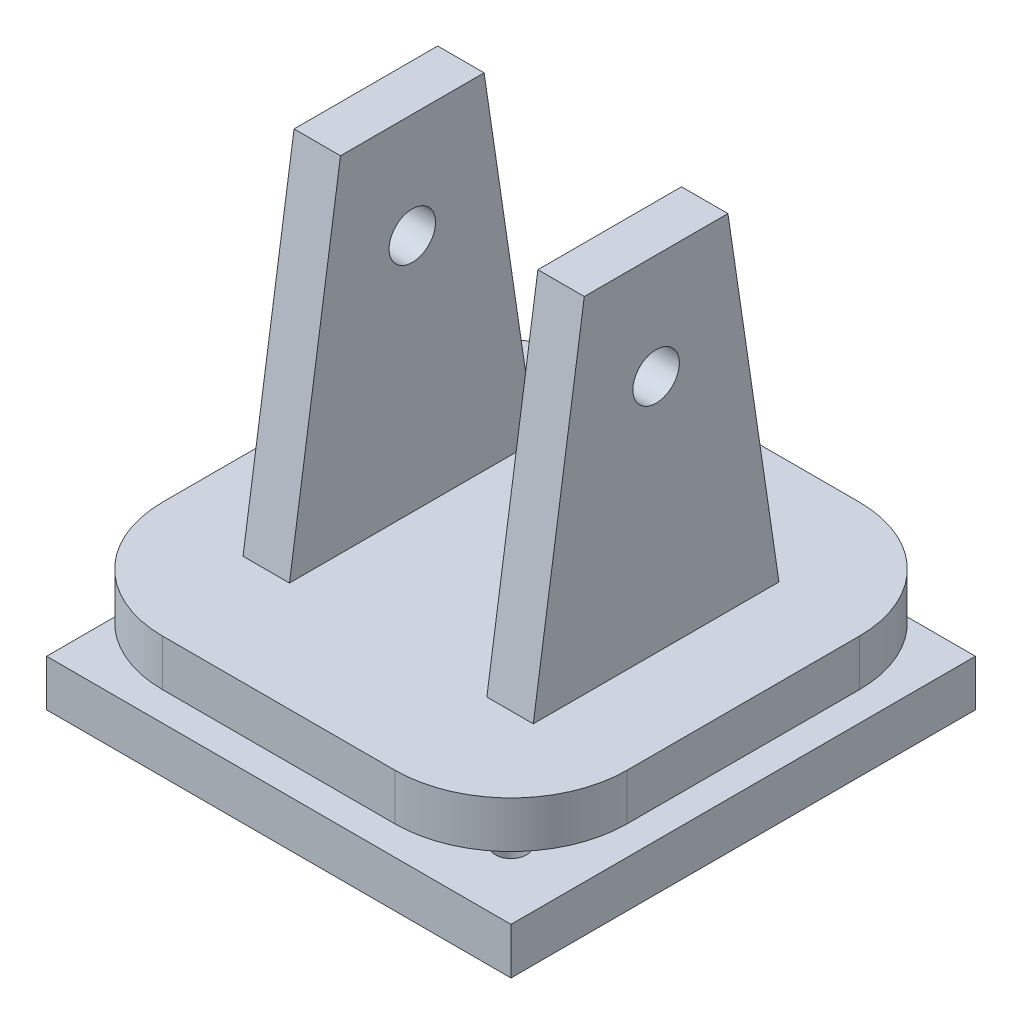
ISO-10303-21;
HEADER;
FILE_DESCRIPTION(('STEP AP214'),'2;1');
FILE_NAME('part.step','',(''),(''),'','','');
FILE_SCHEMA(('AUTOMOTIVE_DESIGN { 1 0 10303 214 1 1 1 1 }'));
ENDSEC;
DATA;
#1=APPLICATION_CONTEXT('core data for automotive mechanical design processes');
#2=APPLICATION_PROTOCOL_DEFINITION('international standard','automotive_design',2000,#1);
#3=PRODUCT_CONTEXT('',#1,'mechanical');
#4=PRODUCT('Part','Part','',(#3));
#5=PRODUCT_RELATED_PRODUCT_CATEGORY('part','',(#4));
#6=PRODUCT_DEFINITION_FORMATION('','',#4);
#7=PRODUCT_DEFINITION_CONTEXT('part definition',#1,'design');
#8=PRODUCT_DEFINITION('design','',#6,#7);
#9=PRODUCT_DEFINITION_SHAPE('','',#8);
#10=(LENGTH_UNIT() NAMED_UNIT(*) SI_UNIT(.MILLI.,.METRE.));
#11=(NAMED_UNIT(*) PLANE_ANGLE_UNIT() SI_UNIT($,.RADIAN.));
#12=(NAMED_UNIT(*) SI_UNIT($,.STERADIAN.) SOLID_ANGLE_UNIT());
#13=UNCERTAINTY_MEASURE_WITH_UNIT(LENGTH_MEASURE(1.E-05),#10,'distance_accuracy_value','');
#14=(GEOMETRIC_REPRESENTATION_CONTEXT(3) GLOBAL_UNCERTAINTY_ASSIGNED_CONTEXT((#13)) GLOBAL_UNIT_ASSIGNED_CONTEXT((#10,
#11,#12)) REPRESENTATION_CONTEXT('',''));
#15=CARTESIAN_POINT('',(0.,0.,0.));
#16=DIRECTION('',(0.,0.,1.));
#17=DIRECTION('',(1.,0.,0.));
#18=AXIS2_PLACEMENT_3D('',#15,#16,#17);
#19=CARTESIAN_POINT('',(40.,8.,-40.));
#20=DIRECTION('',(-1.,0.,0.));
#21=DIRECTION('',(0.,0.,1.));
#22=AXIS2_PLACEMENT_3D('',#19,#20,#21);
#23=PLANE('',#22);
#24=DIRECTION('',(0.,0.,-1.));
#25=VECTOR('',#24,1.);
#26=CARTESIAN_POINT('',(40.,0.,-40.));
#27=LINE('',#26,#25);
#28=CARTESIAN_POINT('',(40.,0.,20.));
#29=VERTEX_POINT('',#28);
#30=CARTESIAN_POINT('',(40.,0.,-20.));
#31=VERTEX_POINT('',#30);
#32=EDGE_CURVE('E334',#29,#31,#27,.T.);
#33=ORIENTED_EDGE('',*,*,#32,.T.);
#34=DIRECTION('',(0.,-1.,0.));
#35=VECTOR('',#34,1.);
#36=CARTESIAN_POINT('',(40.,8.,-20.));
#37=LINE('',#36,#35);
#38=CARTESIAN_POINT('',(40.,8.,-20.));
#39=VERTEX_POINT('',#38);
#40=EDGE_CURVE('E391',#31,#39,#37,.F.);
#41=ORIENTED_EDGE('',*,*,#40,.T.);
#42=DIRECTION('',(0.,0.,-1.));
#43=VECTOR('',#42,1.);
#44=CARTESIAN_POINT('',(40.,8.,-40.));
#45=LINE('',#44,#43);
#46=CARTESIAN_POINT('',(40.,8.,20.));
#47=VERTEX_POINT('',#46);
#48=EDGE_CURVE('E335',#47,#39,#45,.T.);
#49=ORIENTED_EDGE('',*,*,#48,.F.);
#50=DIRECTION('',(0.,-1.,0.));
#51=VECTOR('',#50,1.);
#52=CARTESIAN_POINT('',(40.,8.,20.));
#53=LINE('',#52,#51);
#54=EDGE_CURVE('E387',#47,#29,#53,.T.);
#55=ORIENTED_EDGE('',*,*,#54,.T.);
#56=EDGE_LOOP('',(#33,#41,#49,#55));
#57=FACE_BOUND('',#56,.T.);
#58=ADVANCED_FACE('F47',(#57),#23,.F.);
#59=CARTESIAN_POINT('',(-40.,8.,-40.));
#60=DIRECTION('',(0.,0.,1.));
#61=DIRECTION('',(1.,0.,0.));
#62=AXIS2_PLACEMENT_3D('',#59,#60,#61);
#63=PLANE('',#62);
#64=DIRECTION('',(-1.,0.,0.));
#65=VECTOR('',#64,1.);
#66=CARTESIAN_POINT('',(-40.,8.,-40.));
#67=LINE('',#66,#65);
#68=CARTESIAN_POINT('',(20.,8.,-40.));
#69=VERTEX_POINT('',#68);
#70=CARTESIAN_POINT('',(-20.,8.,-40.));
#71=VERTEX_POINT('',#70);
#72=EDGE_CURVE('E339',#69,#71,#67,.T.);
#73=ORIENTED_EDGE('',*,*,#72,.F.);
#74=DIRECTION('',(0.,-1.,0.));
#75=VECTOR('',#74,1.);
#76=CARTESIAN_POINT('',(20.,8.,-40.));
#77=LINE('',#76,#75);
#78=CARTESIAN_POINT('',(20.,0.,-40.));
#79=VERTEX_POINT('',#78);
#80=EDGE_CURVE('E374',#69,#79,#77,.T.);
#81=ORIENTED_EDGE('',*,*,#80,.T.);
#82=DIRECTION('',(-1.,0.,0.));
#83=VECTOR('',#82,1.);
#84=CARTESIAN_POINT('',(-40.,0.,-40.));
#85=LINE('',#84,#83);
#86=CARTESIAN_POINT('',(-20.,0.,-40.));
#87=VERTEX_POINT('',#86);
#88=EDGE_CURVE('E351',#79,#87,#85,.T.);
#89=ORIENTED_EDGE('',*,*,#88,.T.);
#90=DIRECTION('',(0.,-1.,0.));
#91=VECTOR('',#90,1.);
#92=CARTESIAN_POINT('',(-20.,8.,-40.));
#93=LINE('',#92,#91);
#94=EDGE_CURVE('E367',#87,#71,#93,.F.);
#95=ORIENTED_EDGE('',*,*,#94,.T.);
#96=EDGE_LOOP('',(#73,#81,#89,#95));
#97=FACE_BOUND('',#96,.T.);
#98=ADVANCED_FACE('F550',(#97),#63,.F.);
#99=CARTESIAN_POINT('',(-40.,8.,-40.));
#100=DIRECTION('',(1.,0.,0.));
#101=DIRECTION('',(0.,0.,-1.));
#102=AXIS2_PLACEMENT_3D('',#99,#100,#101);
#103=PLANE('',#102);
#104=DIRECTION('',(0.,0.,1.));
#105=VECTOR('',#104,1.);
#106=CARTESIAN_POINT('',(-40.,0.,-40.));
#107=LINE('',#106,#105);
#108=CARTESIAN_POINT('',(-40.,0.,-20.));
#109=VERTEX_POINT('',#108);
#110=CARTESIAN_POINT('',(-40.,0.,20.));
#111=VERTEX_POINT('',#110);
#112=EDGE_CURVE('E354',#109,#111,#107,.T.);
#113=ORIENTED_EDGE('',*,*,#112,.T.);
#114=DIRECTION('',(0.,-1.,0.));
#115=VECTOR('',#114,1.);
#116=CARTESIAN_POINT('',(-40.,8.,20.));
#117=LINE('',#116,#115);
#118=CARTESIAN_POINT('',(-40.,8.,20.));
#119=VERTEX_POINT('',#118);
#120=EDGE_CURVE('E11',#111,#119,#117,.F.);
#121=ORIENTED_EDGE('',*,*,#120,.T.);
#122=DIRECTION('',(0.,0.,1.));
#123=VECTOR('',#122,1.);
#124=CARTESIAN_POINT('',(-40.,8.,-40.));
#125=LINE('',#124,#123);
#126=CARTESIAN_POINT('',(-40.,8.,-20.));
#127=VERTEX_POINT('',#126);
#128=EDGE_CURVE('E343',#127,#119,#125,.T.);
#129=ORIENTED_EDGE('',*,*,#128,.F.);
#130=DIRECTION('',(0.,-1.,0.));
#131=VECTOR('',#130,1.);
#132=CARTESIAN_POINT('',(-40.,8.,-20.));
#133=LINE('',#132,#131);
#134=EDGE_CURVE('E232',#127,#109,#133,.T.);
#135=ORIENTED_EDGE('',*,*,#134,.T.);
#136=EDGE_LOOP('',(#113,#121,#129,#135));
#137=FACE_BOUND('',#136,.T.);
#138=ADVANCED_FACE('F555',(#137),#103,.F.);
#139=CARTESIAN_POINT('',(-40.,8.,40.));
#140=DIRECTION('',(0.,0.,-1.));
#141=DIRECTION('',(-1.,0.,0.));
#142=AXIS2_PLACEMENT_3D('',#139,#140,#141);
#143=PLANE('',#142);
#144=DIRECTION('',(1.,0.,0.));
#145=VECTOR('',#144,1.);
#146=CARTESIAN_POINT('',(-40.,0.,40.));
#147=LINE('',#146,#145);
#148=CARTESIAN_POINT('',(-20.,0.,40.));
#149=VERTEX_POINT('',#148);
#150=CARTESIAN_POINT('',(20.,0.,40.));
#151=VERTEX_POINT('',#150);
#152=EDGE_CURVE('E340',#149,#151,#147,.T.);
#153=ORIENTED_EDGE('',*,*,#152,.T.);
#154=DIRECTION('',(0.,-1.,0.));
#155=VECTOR('',#154,1.);
#156=CARTESIAN_POINT('',(20.,8.,40.));
#157=LINE('',#156,#155);
#158=CARTESIAN_POINT('',(20.,8.,40.));
#159=VERTEX_POINT('',#158);
#160=EDGE_CURVE('E56',#151,#159,#157,.F.);
#161=ORIENTED_EDGE('',*,*,#160,.T.);
#162=DIRECTION('',(1.,0.,0.));
#163=VECTOR('',#162,1.);
#164=CARTESIAN_POINT('',(-40.,8.,40.));
#165=LINE('',#164,#163);
#166=CARTESIAN_POINT('',(-20.,8.,40.));
#167=VERTEX_POINT('',#166);
#168=EDGE_CURVE('E233',#167,#159,#165,.T.);
#169=ORIENTED_EDGE('',*,*,#168,.F.);
#170=DIRECTION('',(0.,-1.,0.));
#171=VECTOR('',#170,1.);
#172=CARTESIAN_POINT('',(-20.,8.,40.));
#173=LINE('',#172,#171);
#174=EDGE_CURVE('E401',#167,#149,#173,.T.);
#175=ORIENTED_EDGE('',*,*,#174,.T.);
#176=EDGE_LOOP('',(#153,#161,#169,#175));
#177=FACE_BOUND('',#176,.T.);
#178=ADVANCED_FACE('F592',(#177),#143,.F.);
#179=CARTESIAN_POINT('',(0.,8.,0.));
#180=DIRECTION('',(0.,1.,0.));
#181=DIRECTION('',(0.,0.,1.));
#182=AXIS2_PLACEMENT_3D('',#179,#180,#181);
#183=PLANE('',#182);
#184=DIRECTION('',(0.,0.,-1.));
#185=VECTOR('',#184,1.);
#186=CARTESIAN_POINT('',(17.,8.,21.1610918877355));
#187=LINE('',#186,#185);
#188=CARTESIAN_POINT('',(17.,8.,21.1610918877355));
#189=VERTEX_POINT('',#188);
#190=CARTESIAN_POINT('',(17.,8.00000000000001,-21.1610918877355));
#191=VERTEX_POINT('',#190);
#192=EDGE_CURVE('E250',#189,#191,#187,.T.);
#193=ORIENTED_EDGE('',*,*,#192,.T.);
#194=DIRECTION('',(1.,0.,0.));
#195=VECTOR('',#194,1.);
#196=CARTESIAN_POINT('',(17.,8.00000000000001,-21.1610918877355));
#197=LINE('',#196,#195);
#198=CARTESIAN_POINT('',(25.,8.00000000000001,-21.1610918877355));
#199=VERTEX_POINT('',#198);
#200=EDGE_CURVE('E267',#191,#199,#197,.T.);
#201=ORIENTED_EDGE('',*,*,#200,.T.);
#202=DIRECTION('',(0.,0.,-1.));
#203=VECTOR('',#202,1.);
#204=CARTESIAN_POINT('',(25.,8.,21.1610918877355));
#205=LINE('',#204,#203);
#206=CARTESIAN_POINT('',(25.,8.,21.1610918877355));
#207=VERTEX_POINT('',#206);
#208=EDGE_CURVE('E249',#207,#199,#205,.T.);
#209=ORIENTED_EDGE('',*,*,#208,.F.);
#210=DIRECTION('',(1.,0.,0.));
#211=VECTOR('',#210,1.);
#212=CARTESIAN_POINT('',(17.,8.,21.1610918877355));
#213=LINE('',#212,#211);
#214=EDGE_CURVE('E289',#189,#207,#213,.T.);
#215=ORIENTED_EDGE('',*,*,#214,.F.);
#216=EDGE_LOOP('',(#193,#201,#209,#215));
#217=FACE_BOUND('',#216,.T.);
#218=DIRECTION('',(0.,0.,-1.));
#219=VECTOR('',#218,1.);
#220=CARTESIAN_POINT('',(-17.,8.,21.1610918877355));
#221=LINE('',#220,#219);
#222=CARTESIAN_POINT('',(-17.,8.,21.1610918877355));
#223=VERTEX_POINT('',#222);
#224=CARTESIAN_POINT('',(-17.,8.00000000000001,-21.1610918877355));
#225=VERTEX_POINT('',#224);
#226=EDGE_CURVE('E294',#223,#225,#221,.T.);
#227=ORIENTED_EDGE('',*,*,#226,.F.);
#228=DIRECTION('',(-1.,0.,0.));
#229=VECTOR('',#228,1.);
#230=CARTESIAN_POINT('',(-17.,8.,21.1610918877355));
#231=LINE('',#230,#229);
#232=CARTESIAN_POINT('',(-25.,8.,21.1610918877355));
#233=VERTEX_POINT('',#232);
#234=EDGE_CURVE('E308',#223,#233,#231,.T.);
#235=ORIENTED_EDGE('',*,*,#234,.T.);
#236=DIRECTION('',(0.,0.,-1.));
#237=VECTOR('',#236,1.);
#238=CARTESIAN_POINT('',(-25.,8.,21.1610918877355));
#239=LINE('',#238,#237);
#240=CARTESIAN_POINT('',(-25.,8.,-21.1610918877355));
#241=VERTEX_POINT('',#240);
#242=EDGE_CURVE('E293',#233,#241,#239,.T.);
#243=ORIENTED_EDGE('',*,*,#242,.T.);
#244=DIRECTION('',(-1.,0.,0.));
#245=VECTOR('',#244,1.);
#246=CARTESIAN_POINT('',(-17.,8.00000000000001,-21.1610918877355));
#247=LINE('',#246,#245);
#248=EDGE_CURVE('E331',#225,#241,#247,.T.);
#249=ORIENTED_EDGE('',*,*,#248,.F.);
#250=EDGE_LOOP('',(#227,#235,#243,#249));
#251=FACE_BOUND('',#250,.T.);
#252=ORIENTED_EDGE('',*,*,#48,.T.);
#253=CARTESIAN_POINT('',(20.,8.,-20.));
#254=DIRECTION('',(0.,1.,0.));
#255=DIRECTION('',(0.,0.,1.));
#256=AXIS2_PLACEMENT_3D('',#253,#254,#255);
#257=CIRCLE('',#256,20.);
#258=EDGE_CURVE('E398',#39,#69,#257,.T.);
#259=ORIENTED_EDGE('',*,*,#258,.T.);
#260=ORIENTED_EDGE('',*,*,#72,.T.);
#261=CARTESIAN_POINT('',(-20.,8.,-20.));
#262=DIRECTION('',(0.,1.,0.));
#263=DIRECTION('',(0.,0.,1.));
#264=AXIS2_PLACEMENT_3D('',#261,#262,#263);
#265=CIRCLE('',#264,20.);
#266=EDGE_CURVE('E371',#71,#127,#265,.T.);
#267=ORIENTED_EDGE('',*,*,#266,.T.);
#268=ORIENTED_EDGE('',*,*,#128,.T.);
#269=CARTESIAN_POINT('',(-20.,8.,20.));
#270=DIRECTION('',(0.,1.,0.));
#271=DIRECTION('',(0.,0.,1.));
#272=AXIS2_PLACEMENT_3D('',#269,#270,#271);
#273=CIRCLE('',#272,20.);
#274=EDGE_CURVE('E69',#119,#167,#273,.T.);
#275=ORIENTED_EDGE('',*,*,#274,.T.);
#276=ORIENTED_EDGE('',*,*,#168,.T.);
#277=CARTESIAN_POINT('',(20.,8.,20.));
#278=DIRECTION('',(0.,1.,0.));
#279=DIRECTION('',(0.,0.,1.));
#280=AXIS2_PLACEMENT_3D('',#277,#278,#279);
#281=CIRCLE('',#280,20.);
#282=EDGE_CURVE('E395',#159,#47,#281,.T.);
#283=ORIENTED_EDGE('',*,*,#282,.T.);
#284=EDGE_LOOP('',(#252,#259,#260,#267,#268,#275,#276,#283));
#285=FACE_BOUND('',#284,.T.);
#286=ADVANCED_FACE('F576',(#217,#251,#285),#183,.T.);
#287=CARTESIAN_POINT('',(0.,0.,0.));
#288=DIRECTION('',(0.,1.,0.));
#289=DIRECTION('',(0.,0.,1.));
#290=AXIS2_PLACEMENT_3D('',#287,#288,#289);
#291=PLANE('',#290);
#292=CARTESIAN_POINT('',(0.,0.,0.));
#293=DIRECTION('',(0.,-1.,0.));
#294=DIRECTION('',(0.,0.,-1.));
#295=AXIS2_PLACEMENT_3D('',#292,#293,#294);
#296=CIRCLE('',#295,15.);
#297=CARTESIAN_POINT('',(0.,0.,-15.));
#298=VERTEX_POINT('',#297);
#299=EDGE_CURVE('E228',#298,#298,#296,.T.);
#300=ORIENTED_EDGE('',*,*,#299,.F.);
#301=EDGE_LOOP('',(#300));
#302=FACE_BOUND('',#301,.T.);
#303=ORIENTED_EDGE('',*,*,#88,.F.);
#304=CARTESIAN_POINT('',(20.,0.,-20.));
#305=DIRECTION('',(0.,1.,0.));
#306=DIRECTION('',(0.,0.,1.));
#307=AXIS2_PLACEMENT_3D('',#304,#305,#306);
#308=CIRCLE('',#307,20.);
#309=EDGE_CURVE('E384',#79,#31,#308,.F.);
#310=ORIENTED_EDGE('',*,*,#309,.T.);
#311=ORIENTED_EDGE('',*,*,#32,.F.);
#312=CARTESIAN_POINT('',(20.,0.,20.));
#313=DIRECTION('',(0.,1.,0.));
#314=DIRECTION('',(0.,0.,1.));
#315=AXIS2_PLACEMENT_3D('',#312,#313,#314);
#316=CIRCLE('',#315,20.);
#317=EDGE_CURVE('E381',#29,#151,#316,.F.);
#318=ORIENTED_EDGE('',*,*,#317,.T.);
#319=ORIENTED_EDGE('',*,*,#152,.F.);
#320=CARTESIAN_POINT('',(-20.,0.,20.));
#321=DIRECTION('',(0.,1.,0.));
#322=DIRECTION('',(0.,0.,1.));
#323=AXIS2_PLACEMENT_3D('',#320,#321,#322);
#324=CIRCLE('',#323,20.);
#325=EDGE_CURVE('E378',#149,#111,#324,.F.);
#326=ORIENTED_EDGE('',*,*,#325,.T.);
#327=ORIENTED_EDGE('',*,*,#112,.F.);
#328=CARTESIAN_POINT('',(-20.,0.,-20.));
#329=DIRECTION('',(0.,1.,0.));
#330=DIRECTION('',(0.,0.,1.));
#331=AXIS2_PLACEMENT_3D('',#328,#329,#330);
#332=CIRCLE('',#331,20.);
#333=EDGE_CURVE('E363',#109,#87,#332,.F.);
#334=ORIENTED_EDGE('',*,*,#333,.T.);
#335=EDGE_LOOP('',(#303,#310,#311,#318,#319,#326,#327,#334));
#336=FACE_BOUND('',#335,.T.);
#337=ADVANCED_FACE('F594',(#302,#336),#291,.F.);
#338=CARTESIAN_POINT('',(-17.,8.00000000000001,-21.1610918877355));
#339=DIRECTION('',(0.,-0.146511293993432,0.989208997498694));
#340=DIRECTION('',(0.,-0.989208997498694,-0.146511293993432));
#341=AXIS2_PLACEMENT_3D('',#338,#339,#340);
#342=PLANE('',#341);
#343=DIRECTION('',(0.,0.989208997498693,0.146511293993432));
#344=VECTOR('',#343,1.);
#345=CARTESIAN_POINT('',(-25.,8.00000000000001,-21.1610918877355));
#346=LINE('',#345,#344);
#347=CARTESIAN_POINT('',(-25.,67.3525398499216,-12.3704142481296));
#348=VERTEX_POINT('',#347);
#349=EDGE_CURVE('E312',#241,#348,#346,.T.);
#350=ORIENTED_EDGE('',*,*,#349,.T.);
#351=DIRECTION('',(-1.,0.,0.));
#352=VECTOR('',#351,1.);
#353=CARTESIAN_POINT('',(-17.,67.3525398499216,-12.3704142481296));
#354=LINE('',#353,#352);
#355=CARTESIAN_POINT('',(-17.,67.3525398499216,-12.3704142481296));
#356=VERTEX_POINT('',#355);
#357=EDGE_CURVE('E327',#356,#348,#354,.T.);
#358=ORIENTED_EDGE('',*,*,#357,.F.);
#359=DIRECTION('',(0.,0.989208997498693,0.146511293993432));
#360=VECTOR('',#359,1.);
#361=CARTESIAN_POINT('',(-17.,8.00000000000001,-21.1610918877355));
#362=LINE('',#361,#360);
#363=EDGE_CURVE('E298',#225,#356,#362,.T.);
#364=ORIENTED_EDGE('',*,*,#363,.F.);
#365=ORIENTED_EDGE('',*,*,#248,.T.);
#366=EDGE_LOOP('',(#350,#358,#364,#365));
#367=FACE_BOUND('',#366,.T.);
#368=ADVANCED_FACE('F596',(#367),#342,.F.);
#369=CARTESIAN_POINT('',(-17.,67.3525398499216,12.3704142481296));
#370=DIRECTION('',(0.,-1.,0.));
#371=DIRECTION('',(0.,0.,-1.));
#372=AXIS2_PLACEMENT_3D('',#369,#370,#371);
#373=PLANE('',#372);
#374=DIRECTION('',(0.,0.,1.));
#375=VECTOR('',#374,1.);
#376=CARTESIAN_POINT('',(-25.,67.3525398499216,12.3704142481296));
#377=LINE('',#376,#375);
#378=CARTESIAN_POINT('',(-25.,67.3525398499216,12.3704142481296));
#379=VERTEX_POINT('',#378);
#380=EDGE_CURVE('E315',#348,#379,#377,.T.);
#381=ORIENTED_EDGE('',*,*,#380,.T.);
#382=DIRECTION('',(-1.,0.,0.));
#383=VECTOR('',#382,1.);
#384=CARTESIAN_POINT('',(-17.,67.3525398499216,12.3704142481296));
#385=LINE('',#384,#383);
#386=CARTESIAN_POINT('',(-17.,67.3525398499216,12.3704142481296));
#387=VERTEX_POINT('',#386);
#388=EDGE_CURVE('E323',#387,#379,#385,.T.);
#389=ORIENTED_EDGE('',*,*,#388,.F.);
#390=DIRECTION('',(0.,0.,1.));
#391=VECTOR('',#390,1.);
#392=CARTESIAN_POINT('',(-17.,67.3525398499216,12.3704142481296));
#393=LINE('',#392,#391);
#394=EDGE_CURVE('E302',#356,#387,#393,.T.);
#395=ORIENTED_EDGE('',*,*,#394,.F.);
#396=ORIENTED_EDGE('',*,*,#357,.T.);
#397=EDGE_LOOP('',(#381,#389,#395,#396));
#398=FACE_BOUND('',#397,.T.);
#399=ADVANCED_FACE('F602',(#398),#373,.F.);
#400=CARTESIAN_POINT('',(-17.,8.,21.1610918877355));
#401=DIRECTION('',(0.,-0.146511293993432,-0.989208997498694));
#402=DIRECTION('',(0.,0.989208997498694,-0.146511293993432));
#403=AXIS2_PLACEMENT_3D('',#400,#401,#402);
#404=PLANE('',#403);
#405=DIRECTION('',(0.,-0.989208997498694,0.146511293993432));
#406=VECTOR('',#405,1.);
#407=CARTESIAN_POINT('',(-25.,8.,21.1610918877355));
#408=LINE('',#407,#406);
#409=EDGE_CURVE('E299',#379,#233,#408,.T.);
#410=ORIENTED_EDGE('',*,*,#409,.T.);
#411=ORIENTED_EDGE('',*,*,#234,.F.);
#412=DIRECTION('',(0.,-0.989208997498694,0.146511293993432));
#413=VECTOR('',#412,1.);
#414=CARTESIAN_POINT('',(-17.,8.,21.1610918877355));
#415=LINE('',#414,#413);
#416=EDGE_CURVE('E305',#387,#223,#415,.T.);
#417=ORIENTED_EDGE('',*,*,#416,.F.);
#418=ORIENTED_EDGE('',*,*,#388,.T.);
#419=EDGE_LOOP('',(#410,#411,#417,#418));
#420=FACE_BOUND('',#419,.T.);
#421=ADVANCED_FACE('F763',(#420),#404,.F.);
#422=CARTESIAN_POINT('',(-17.,0.,0.));
#423=DIRECTION('',(1.,0.,0.));
#424=DIRECTION('',(0.,0.,-1.));
#425=AXIS2_PLACEMENT_3D('',#422,#423,#424);
#426=PLANE('',#425);
#427=CARTESIAN_POINT('',(-17.,49.2509060071564,0.));
#428=DIRECTION('',(1.,0.,0.));
#429=DIRECTION('',(0.,0.,-1.));
#430=AXIS2_PLACEMENT_3D('',#427,#428,#429);
#431=CIRCLE('',#430,4.);
#432=CARTESIAN_POINT('',(-17.,49.2509060071564,-4.));
#433=VERTEX_POINT('',#432);
#434=EDGE_CURVE('E245',#433,#433,#431,.T.);
#435=ORIENTED_EDGE('',*,*,#434,.F.);
#436=EDGE_LOOP('',(#435));
#437=FACE_BOUND('',#436,.T.);
#438=ORIENTED_EDGE('',*,*,#226,.T.);
#439=ORIENTED_EDGE('',*,*,#363,.T.);
#440=ORIENTED_EDGE('',*,*,#394,.T.);
#441=ORIENTED_EDGE('',*,*,#416,.T.);
#442=EDGE_LOOP('',(#438,#439,#440,#441));
#443=FACE_BOUND('',#442,.T.);
#444=ADVANCED_FACE('F752',(#437,#443),#426,.T.);
#445=CARTESIAN_POINT('',(-25.,0.,0.));
#446=DIRECTION('',(1.,0.,0.));
#447=DIRECTION('',(0.,0.,-1.));
#448=AXIS2_PLACEMENT_3D('',#445,#446,#447);
#449=PLANE('',#448);
#450=CARTESIAN_POINT('',(-25.,49.2509060071564,0.));
#451=DIRECTION('',(1.,0.,0.));
#452=DIRECTION('',(0.,0.,-1.));
#453=AXIS2_PLACEMENT_3D('',#450,#451,#452);
#454=CIRCLE('',#453,4.);
#455=CARTESIAN_POINT('',(-25.,49.2509060071564,-4.));
#456=VERTEX_POINT('',#455);
#457=EDGE_CURVE('E241',#456,#456,#454,.T.);
#458=ORIENTED_EDGE('',*,*,#457,.T.);
#459=EDGE_LOOP('',(#458));
#460=FACE_BOUND('',#459,.T.);
#461=ORIENTED_EDGE('',*,*,#242,.F.);
#462=ORIENTED_EDGE('',*,*,#409,.F.);
#463=ORIENTED_EDGE('',*,*,#380,.F.);
#464=ORIENTED_EDGE('',*,*,#349,.F.);
#465=EDGE_LOOP('',(#461,#462,#463,#464));
#466=FACE_BOUND('',#465,.T.);
#467=ADVANCED_FACE('F746',(#460,#466),#449,.F.);
#468=CARTESIAN_POINT('',(17.,8.,21.1610918877355));
#469=DIRECTION('',(0.,0.146511293993432,0.989208997498694));
#470=DIRECTION('',(0.,-0.989208997498694,0.146511293993432));
#471=AXIS2_PLACEMENT_3D('',#468,#469,#470);
#472=PLANE('',#471);
#473=DIRECTION('',(0.,-0.989208997498694,0.146511293993432));
#474=VECTOR('',#473,1.);
#475=CARTESIAN_POINT('',(25.,8.,21.1610918877355));
#476=LINE('',#475,#474);
#477=CARTESIAN_POINT('',(25.,67.3525398499216,12.3704142481296));
#478=VERTEX_POINT('',#477);
#479=EDGE_CURVE('E270',#478,#207,#476,.T.);
#480=ORIENTED_EDGE('',*,*,#479,.F.);
#481=DIRECTION('',(1.,0.,0.));
#482=VECTOR('',#481,1.);
#483=CARTESIAN_POINT('',(17.,67.3525398499216,12.3704142481296));
#484=LINE('',#483,#482);
#485=CARTESIAN_POINT('',(17.,67.3525398499216,12.3704142481296));
#486=VERTEX_POINT('',#485);
#487=EDGE_CURVE('E286',#486,#478,#484,.T.);
#488=ORIENTED_EDGE('',*,*,#487,.F.);
#489=DIRECTION('',(0.,-0.989208997498694,0.146511293993432));
#490=VECTOR('',#489,1.);
#491=CARTESIAN_POINT('',(17.,8.,21.1610918877355));
#492=LINE('',#491,#490);
#493=EDGE_CURVE('E254',#486,#189,#492,.T.);
#494=ORIENTED_EDGE('',*,*,#493,.T.);
#495=ORIENTED_EDGE('',*,*,#214,.T.);
#496=EDGE_LOOP('',(#480,#488,#494,#495));
#497=FACE_BOUND('',#496,.T.);
#498=ADVANCED_FACE('F751',(#497),#472,.T.);
#499=CARTESIAN_POINT('',(17.,67.3525398499216,12.3704142481296));
#500=DIRECTION('',(0.,1.,0.));
#501=DIRECTION('',(0.,0.,1.));
#502=AXIS2_PLACEMENT_3D('',#499,#500,#501);
#503=PLANE('',#502);
#504=DIRECTION('',(0.,0.,1.));
#505=VECTOR('',#504,1.);
#506=CARTESIAN_POINT('',(25.,67.3525398499216,12.3704142481296));
#507=LINE('',#506,#505);
#508=CARTESIAN_POINT('',(25.,67.3525398499216,-12.3704142481296));
#509=VERTEX_POINT('',#508);
#510=EDGE_CURVE('E273',#509,#478,#507,.T.);
#511=ORIENTED_EDGE('',*,*,#510,.F.);
#512=DIRECTION('',(1.,0.,0.));
#513=VECTOR('',#512,1.);
#514=CARTESIAN_POINT('',(17.,67.3525398499216,-12.3704142481296));
#515=LINE('',#514,#513);
#516=CARTESIAN_POINT('',(17.,67.3525398499216,-12.3704142481296));
#517=VERTEX_POINT('',#516);
#518=EDGE_CURVE('E283',#517,#509,#515,.T.);
#519=ORIENTED_EDGE('',*,*,#518,.F.);
#520=DIRECTION('',(0.,0.,1.));
#521=VECTOR('',#520,1.);
#522=CARTESIAN_POINT('',(17.,67.3525398499216,12.3704142481296));
#523=LINE('',#522,#521);
#524=EDGE_CURVE('E259',#517,#486,#523,.T.);
#525=ORIENTED_EDGE('',*,*,#524,.T.);
#526=ORIENTED_EDGE('',*,*,#487,.T.);
#527=EDGE_LOOP('',(#511,#519,#525,#526));
#528=FACE_BOUND('',#527,.T.);
#529=ADVANCED_FACE('F772',(#528),#503,.T.);
#530=CARTESIAN_POINT('',(17.,8.00000000000001,-21.1610918877355));
#531=DIRECTION('',(0.,0.146511293993432,-0.989208997498694));
#532=DIRECTION('',(0.,0.989208997498694,0.146511293993432));
#533=AXIS2_PLACEMENT_3D('',#530,#531,#532);
#534=PLANE('',#533);
#535=DIRECTION('',(0.,0.989208997498693,0.146511293993432));
#536=VECTOR('',#535,1.);
#537=CARTESIAN_POINT('',(25.,8.00000000000001,-21.1610918877355));
#538=LINE('',#537,#536);
#539=EDGE_CURVE('E255',#199,#509,#538,.T.);
#540=ORIENTED_EDGE('',*,*,#539,.F.);
#541=ORIENTED_EDGE('',*,*,#200,.F.);
#542=DIRECTION('',(0.,0.989208997498693,0.146511293993432));
#543=VECTOR('',#542,1.);
#544=CARTESIAN_POINT('',(17.,8.00000000000001,-21.1610918877355));
#545=LINE('',#544,#543);
#546=EDGE_CURVE('E263',#191,#517,#545,.T.);
#547=ORIENTED_EDGE('',*,*,#546,.T.);
#548=ORIENTED_EDGE('',*,*,#518,.T.);
#549=EDGE_LOOP('',(#540,#541,#547,#548));
#550=FACE_BOUND('',#549,.T.);
#551=ADVANCED_FACE('F739',(#550),#534,.T.);
#552=CARTESIAN_POINT('',(17.,0.,0.));
#553=DIRECTION('',(-1.,0.,0.));
#554=DIRECTION('',(0.,0.,-1.));
#555=AXIS2_PLACEMENT_3D('',#552,#553,#554);
#556=PLANE('',#555);
#557=CARTESIAN_POINT('',(17.,49.2509060071564,0.));
#558=DIRECTION('',(-1.,0.,0.));
#559=DIRECTION('',(0.,0.,1.));
#560=AXIS2_PLACEMENT_3D('',#557,#558,#559);
#561=CIRCLE('',#560,4.);
#562=CARTESIAN_POINT('',(17.,49.2509060071564,4.));
#563=VERTEX_POINT('',#562);
#564=EDGE_CURVE('E237',#563,#563,#561,.T.);
#565=ORIENTED_EDGE('',*,*,#564,.F.);
#566=EDGE_LOOP('',(#565));
#567=FACE_BOUND('',#566,.T.);
#568=ORIENTED_EDGE('',*,*,#192,.F.);
#569=ORIENTED_EDGE('',*,*,#493,.F.);
#570=ORIENTED_EDGE('',*,*,#524,.F.);
#571=ORIENTED_EDGE('',*,*,#546,.F.);
#572=EDGE_LOOP('',(#568,#569,#570,#571));
#573=FACE_BOUND('',#572,.T.);
#574=ADVANCED_FACE('F730',(#567,#573),#556,.T.);
#575=CARTESIAN_POINT('',(25.,0.,0.));
#576=DIRECTION('',(-1.,0.,0.));
#577=DIRECTION('',(0.,0.,-1.));
#578=AXIS2_PLACEMENT_3D('',#575,#576,#577);
#579=PLANE('',#578);
#580=CARTESIAN_POINT('',(25.,49.2509060071564,0.));
#581=DIRECTION('',(1.,0.,0.));
#582=DIRECTION('',(0.,0.,-1.));
#583=AXIS2_PLACEMENT_3D('',#580,#581,#582);
#584=CIRCLE('',#583,4.);
#585=CARTESIAN_POINT('',(25.,49.2509060071564,-4.));
#586=VERTEX_POINT('',#585);
#587=EDGE_CURVE('E221',#586,#586,#584,.T.);
#588=ORIENTED_EDGE('',*,*,#587,.F.);
#589=EDGE_LOOP('',(#588));
#590=FACE_BOUND('',#589,.T.);
#591=ORIENTED_EDGE('',*,*,#208,.T.);
#592=ORIENTED_EDGE('',*,*,#539,.T.);
#593=ORIENTED_EDGE('',*,*,#510,.T.);
#594=ORIENTED_EDGE('',*,*,#479,.T.);
#595=EDGE_LOOP('',(#591,#592,#593,#594));
#596=FACE_BOUND('',#595,.T.);
#597=ADVANCED_FACE('F722',(#590,#596),#579,.F.);
#598=CARTESIAN_POINT('',(-60.,49.2509060071564,0.));
#599=DIRECTION('',(1.,0.,0.));
#600=DIRECTION('',(0.,0.,-1.));
#601=AXIS2_PLACEMENT_3D('',#598,#599,#600);
#602=CYLINDRICAL_SURFACE('',#601,4.);
#603=ORIENTED_EDGE('',*,*,#564,.T.);
#604=EDGE_LOOP('',(#603));
#605=FACE_BOUND('',#604,.T.);
#606=ORIENTED_EDGE('',*,*,#587,.T.);
#607=EDGE_LOOP('',(#606));
#608=FACE_BOUND('',#607,.T.);
#609=ADVANCED_FACE('F713',(#605,#608),#602,.F.);
#610=ORIENTED_EDGE('',*,*,#434,.T.);
#611=EDGE_LOOP('',(#610));
#612=FACE_BOUND('',#611,.T.);
#613=ORIENTED_EDGE('',*,*,#457,.F.);
#614=EDGE_LOOP('',(#613));
#615=FACE_BOUND('',#614,.T.);
#616=ADVANCED_FACE('F543',(#612,#615),#602,.F.);
#617=CARTESIAN_POINT('',(0.,-5.,0.));
#618=DIRECTION('',(0.,1.,0.));
#619=DIRECTION('',(0.,0.,1.));
#620=AXIS2_PLACEMENT_3D('',#617,#618,#619);
#621=CYLINDRICAL_SURFACE('',#620,15.);
#622=CARTESIAN_POINT('',(0.,-5.,0.));
#623=DIRECTION('',(0.,-1.,0.));
#624=DIRECTION('',(0.,0.,-1.));
#625=AXIS2_PLACEMENT_3D('',#622,#623,#624);
#626=CIRCLE('',#625,15.);
#627=CARTESIAN_POINT('',(0.,-5.,-15.));
#628=VERTEX_POINT('',#627);
#629=EDGE_CURVE('E214',#628,#628,#626,.T.);
#630=ORIENTED_EDGE('',*,*,#629,.F.);
#631=EDGE_LOOP('',(#630));
#632=FACE_BOUND('',#631,.T.);
#633=ORIENTED_EDGE('',*,*,#299,.T.);
#634=EDGE_LOOP('',(#633));
#635=FACE_BOUND('',#634,.T.);
#636=ADVANCED_FACE('F535',(#632,#635),#621,.T.);
#637=CARTESIAN_POINT('',(0.,-13.,0.));
#638=DIRECTION('',(0.,-1.,0.));
#639=DIRECTION('',(0.,0.,-1.));
#640=AXIS2_PLACEMENT_3D('',#637,#638,#639);
#641=PLANE('',#640);
#642=CARTESIAN_POINT('',(28.2842712474635,-13.,-28.2842712474603));
#643=DIRECTION('',(0.,-1.,0.));
#644=DIRECTION('',(0.,0.,-1.));
#645=AXIS2_PLACEMENT_3D('',#642,#643,#644);
#646=CIRCLE('',#645,2.6882086937067);
#647=CARTESIAN_POINT('',(28.2842712474635,-13.,-30.972479941167));
#648=VERTEX_POINT('',#647);
#649=EDGE_CURVE('E497',#648,#648,#646,.T.);
#650=ORIENTED_EDGE('',*,*,#649,.F.);
#651=EDGE_LOOP('',(#650));
#652=FACE_BOUND('',#651,.T.);
#653=CARTESIAN_POINT('',(-28.2842712474619,-13.,28.2842712474619));
#654=DIRECTION('',(0.,-1.,0.));
#655=DIRECTION('',(0.,0.,-1.));
#656=AXIS2_PLACEMENT_3D('',#653,#654,#655);
#657=CIRCLE('',#656,2.68820869370443);
#658=CARTESIAN_POINT('',(-28.2842712474619,-13.,25.5960625537575));
#659=VERTEX_POINT('',#658);
#660=EDGE_CURVE('E427',#659,#659,#657,.T.);
#661=ORIENTED_EDGE('',*,*,#660,.F.);
#662=EDGE_LOOP('',(#661));
#663=FACE_BOUND('',#662,.T.);
#664=DIRECTION('',(0.,0.,1.));
#665=VECTOR('',#664,1.);
#666=CARTESIAN_POINT('',(40.,-13.,40.));
#667=LINE('',#666,#665);
#668=CARTESIAN_POINT('',(40.,-13.,-40.));
#669=VERTEX_POINT('',#668);
#670=CARTESIAN_POINT('',(40.,-13.,40.));
#671=VERTEX_POINT('',#670);
#672=EDGE_CURVE('E197',#669,#671,#667,.T.);
#673=ORIENTED_EDGE('',*,*,#672,.T.);
#674=DIRECTION('',(-1.,0.,0.));
#675=VECTOR('',#674,1.);
#676=CARTESIAN_POINT('',(-40.,-13.,40.));
#677=LINE('',#676,#675);
#678=CARTESIAN_POINT('',(-40.,-13.,40.));
#679=VERTEX_POINT('',#678);
#680=EDGE_CURVE('E185',#671,#679,#677,.T.);
#681=ORIENTED_EDGE('',*,*,#680,.T.);
#682=DIRECTION('',(0.,0.,-1.));
#683=VECTOR('',#682,1.);
#684=CARTESIAN_POINT('',(-40.,-13.,40.));
#685=LINE('',#684,#683);
#686=CARTESIAN_POINT('',(-40.,-13.,-40.));
#687=VERTEX_POINT('',#686);
#688=EDGE_CURVE('E196',#679,#687,#685,.T.);
#689=ORIENTED_EDGE('',*,*,#688,.T.);
#690=DIRECTION('',(1.,0.,0.));
#691=VECTOR('',#690,1.);
#692=CARTESIAN_POINT('',(-40.,-13.,-40.));
#693=LINE('',#692,#691);
#694=EDGE_CURVE('E203',#687,#669,#693,.T.);
#695=ORIENTED_EDGE('',*,*,#694,.T.);
#696=EDGE_LOOP('',(#673,#681,#689,#695));
#697=FACE_BOUND('',#696,.T.);
#698=CARTESIAN_POINT('',(28.2842712474619,-13.,28.2842712474635));
#699=DIRECTION('',(0.,-1.,0.));
#700=DIRECTION('',(0.,0.,-1.));
#701=AXIS2_PLACEMENT_3D('',#698,#699,#700);
#702=CIRCLE('',#701,2.68820869370609);
#703=CARTESIAN_POINT('',(28.2842712474619,-13.,25.5960625537574));
#704=VERTEX_POINT('',#703);
#705=EDGE_CURVE('E428',#704,#704,#702,.T.);
#706=ORIENTED_EDGE('',*,*,#705,.F.);
#707=EDGE_LOOP('',(#706));
#708=FACE_BOUND('',#707,.T.);
#709=CARTESIAN_POINT('',(-28.2842712474603,-13.,-28.2842712474619));
#710=DIRECTION('',(0.,-1.,0.));
#711=DIRECTION('',(0.,0.,-1.));
#712=AXIS2_PLACEMENT_3D('',#709,#710,#711);
#713=CIRCLE('',#712,2.68820869370527);
#714=CARTESIAN_POINT('',(-28.2842712474603,-13.,-30.9724799411672));
#715=VERTEX_POINT('',#714);
#716=EDGE_CURVE('E481',#715,#715,#713,.T.);
#717=ORIENTED_EDGE('',*,*,#716,.F.);
#718=EDGE_LOOP('',(#717));
#719=FACE_BOUND('',#718,.T.);
#720=ADVANCED_FACE('F200',(#652,#663,#697,#708,#719),#641,.T.);
#721=CARTESIAN_POINT('',(0.,-5.,0.));
#722=DIRECTION('',(0.,-1.,0.));
#723=DIRECTION('',(0.,0.,-1.));
#724=AXIS2_PLACEMENT_3D('',#721,#722,#723);
#725=PLANE('',#724);
#726=ORIENTED_EDGE('',*,*,#629,.T.);
#727=EDGE_LOOP('',(#726));
#728=FACE_BOUND('',#727,.T.);
#729=DIRECTION('',(0.,0.,1.));
#730=VECTOR('',#729,1.);
#731=CARTESIAN_POINT('',(40.,-5.,40.));
#732=LINE('',#731,#730);
#733=CARTESIAN_POINT('',(40.,-5.,-40.));
#734=VERTEX_POINT('',#733);
#735=CARTESIAN_POINT('',(40.,-5.,40.));
#736=VERTEX_POINT('',#735);
#737=EDGE_CURVE('E212',#734,#736,#732,.T.);
#738=ORIENTED_EDGE('',*,*,#737,.F.);
#739=DIRECTION('',(1.,0.,0.));
#740=VECTOR('',#739,1.);
#741=CARTESIAN_POINT('',(-40.,-5.,-40.));
#742=LINE('',#741,#740);
#743=CARTESIAN_POINT('',(-40.,-5.,-40.));
#744=VERTEX_POINT('',#743);
#745=EDGE_CURVE('E208',#744,#734,#742,.T.);
#746=ORIENTED_EDGE('',*,*,#745,.F.);
#747=DIRECTION('',(0.,0.,-1.));
#748=VECTOR('',#747,1.);
#749=CARTESIAN_POINT('',(-40.,-5.,40.));
#750=LINE('',#749,#748);
#751=CARTESIAN_POINT('',(-40.,-5.,40.));
#752=VERTEX_POINT('',#751);
#753=EDGE_CURVE('E470',#752,#744,#750,.T.);
#754=ORIENTED_EDGE('',*,*,#753,.F.);
#755=DIRECTION('',(-1.,0.,0.));
#756=VECTOR('',#755,1.);
#757=CARTESIAN_POINT('',(-40.,-5.,40.));
#758=LINE('',#757,#756);
#759=EDGE_CURVE('E506',#736,#752,#758,.T.);
#760=ORIENTED_EDGE('',*,*,#759,.F.);
#761=EDGE_LOOP('',(#738,#746,#754,#760));
#762=FACE_BOUND('',#761,.T.);
#763=CARTESIAN_POINT('',(-28.2842712474619,-5.,28.2842712474619));
#764=DIRECTION('',(0.,-1.,0.));
#765=DIRECTION('',(0.,0.,-1.));
#766=AXIS2_PLACEMENT_3D('',#763,#764,#765);
#767=CIRCLE('',#766,2.68820869370443);
#768=CARTESIAN_POINT('',(-28.2842712474619,-5.,25.5960625537575));
#769=VERTEX_POINT('',#768);
#770=EDGE_CURVE('E424',#769,#769,#767,.T.);
#771=ORIENTED_EDGE('',*,*,#770,.T.);
#772=EDGE_LOOP('',(#771));
#773=FACE_BOUND('',#772,.T.);
#774=CARTESIAN_POINT('',(28.2842712474619,-5.,28.2842712474635));
#775=DIRECTION('',(0.,-1.,0.));
#776=DIRECTION('',(0.,0.,-1.));
#777=AXIS2_PLACEMENT_3D('',#774,#775,#776);
#778=CIRCLE('',#777,2.68820869370609);
#779=CARTESIAN_POINT('',(28.2842712474619,-5.,25.5960625537574));
#780=VERTEX_POINT('',#779);
#781=EDGE_CURVE('E490',#780,#780,#778,.T.);
#782=ORIENTED_EDGE('',*,*,#781,.T.);
#783=EDGE_LOOP('',(#782));
#784=FACE_BOUND('',#783,.T.);
#785=CARTESIAN_POINT('',(28.2842712474635,-5.,-28.2842712474603));
#786=DIRECTION('',(0.,-1.,0.));
#787=DIRECTION('',(0.,0.,-1.));
#788=AXIS2_PLACEMENT_3D('',#785,#786,#787);
#789=CIRCLE('',#788,2.6882086937067);
#790=CARTESIAN_POINT('',(28.2842712474635,-5.,-30.972479941167));
#791=VERTEX_POINT('',#790);
#792=EDGE_CURVE('E501',#791,#791,#789,.T.);
#793=ORIENTED_EDGE('',*,*,#792,.T.);
#794=EDGE_LOOP('',(#793));
#795=FACE_BOUND('',#794,.T.);
#796=CARTESIAN_POINT('',(-28.2842712474603,-5.,-28.2842712474619));
#797=DIRECTION('',(0.,-1.,0.));
#798=DIRECTION('',(0.,0.,-1.));
#799=AXIS2_PLACEMENT_3D('',#796,#797,#798);
#800=CIRCLE('',#799,2.68820869370527);
#801=CARTESIAN_POINT('',(-28.2842712474603,-5.,-30.9724799411672));
#802=VERTEX_POINT('',#801);
#803=EDGE_CURVE('E522',#802,#802,#800,.T.);
#804=ORIENTED_EDGE('',*,*,#803,.T.);
#805=EDGE_LOOP('',(#804));
#806=FACE_BOUND('',#805,.T.);
#807=ADVANCED_FACE('F534',(#728,#762,#773,#784,#795,#806),#725,.F.);
#808=CARTESIAN_POINT('',(40.,-13.,40.));
#809=DIRECTION('',(-1.,0.,0.));
#810=DIRECTION('',(0.,0.,1.));
#811=AXIS2_PLACEMENT_3D('',#808,#809,#810);
#812=PLANE('',#811);
#813=ORIENTED_EDGE('',*,*,#737,.T.);
#814=DIRECTION('',(0.,1.,0.));
#815=VECTOR('',#814,1.);
#816=CARTESIAN_POINT('',(40.,-13.,40.));
#817=LINE('',#816,#815);
#818=EDGE_CURVE('E189',#671,#736,#817,.T.);
#819=ORIENTED_EDGE('',*,*,#818,.F.);
#820=ORIENTED_EDGE('',*,*,#672,.F.);
#821=DIRECTION('',(0.,1.,0.));
#822=VECTOR('',#821,1.);
#823=CARTESIAN_POINT('',(40.,-13.,-40.));
#824=LINE('',#823,#822);
#825=EDGE_CURVE('E442',#669,#734,#824,.T.);
#826=ORIENTED_EDGE('',*,*,#825,.T.);
#827=EDGE_LOOP('',(#813,#819,#820,#826));
#828=FACE_BOUND('',#827,.T.);
#829=ADVANCED_FACE('F210',(#828),#812,.F.);
#830=CARTESIAN_POINT('',(-40.,-13.,40.));
#831=DIRECTION('',(0.,0.,-1.));
#832=DIRECTION('',(-1.,0.,0.));
#833=AXIS2_PLACEMENT_3D('',#830,#831,#832);
#834=PLANE('',#833);
#835=ORIENTED_EDGE('',*,*,#759,.T.);
#836=DIRECTION('',(0.,1.,0.));
#837=VECTOR('',#836,1.);
#838=CARTESIAN_POINT('',(-40.,-13.,40.));
#839=LINE('',#838,#837);
#840=EDGE_CURVE('E192',#679,#752,#839,.T.);
#841=ORIENTED_EDGE('',*,*,#840,.F.);
#842=ORIENTED_EDGE('',*,*,#680,.F.);
#843=ORIENTED_EDGE('',*,*,#818,.T.);
#844=EDGE_LOOP('',(#835,#841,#842,#843));
#845=FACE_BOUND('',#844,.T.);
#846=ADVANCED_FACE('F187',(#845),#834,.F.);
#847=CARTESIAN_POINT('',(-40.,-13.,40.));
#848=DIRECTION('',(1.,0.,0.));
#849=DIRECTION('',(0.,0.,-1.));
#850=AXIS2_PLACEMENT_3D('',#847,#848,#849);
#851=PLANE('',#850);
#852=ORIENTED_EDGE('',*,*,#753,.T.);
#853=DIRECTION('',(0.,1.,0.));
#854=VECTOR('',#853,1.);
#855=CARTESIAN_POINT('',(-40.,-13.,-40.));
#856=LINE('',#855,#854);
#857=EDGE_CURVE('E224',#687,#744,#856,.T.);
#858=ORIENTED_EDGE('',*,*,#857,.F.);
#859=ORIENTED_EDGE('',*,*,#688,.F.);
#860=ORIENTED_EDGE('',*,*,#840,.T.);
#861=EDGE_LOOP('',(#852,#858,#859,#860));
#862=FACE_BOUND('',#861,.T.);
#863=ADVANCED_FACE('F674',(#862),#851,.F.);
#864=CARTESIAN_POINT('',(-40.,-13.,-40.));
#865=DIRECTION('',(0.,0.,1.));
#866=DIRECTION('',(1.,0.,0.));
#867=AXIS2_PLACEMENT_3D('',#864,#865,#866);
#868=PLANE('',#867);
#869=ORIENTED_EDGE('',*,*,#745,.T.);
#870=ORIENTED_EDGE('',*,*,#825,.F.);
#871=ORIENTED_EDGE('',*,*,#694,.F.);
#872=ORIENTED_EDGE('',*,*,#857,.T.);
#873=EDGE_LOOP('',(#869,#870,#871,#872));
#874=FACE_BOUND('',#873,.T.);
#875=ADVANCED_FACE('F668',(#874),#868,.F.);
#876=CARTESIAN_POINT('',(-28.2842712474619,-13.,28.2842712474619));
#877=DIRECTION('',(0.,1.,0.));
#878=DIRECTION('',(0.,0.,1.));
#879=AXIS2_PLACEMENT_3D('',#876,#877,#878);
#880=CYLINDRICAL_SURFACE('',#879,2.68820869370443);
#881=ORIENTED_EDGE('',*,*,#660,.T.);
#882=EDGE_LOOP('',(#881));
#883=FACE_BOUND('',#882,.T.);
#884=ORIENTED_EDGE('',*,*,#770,.F.);
#885=EDGE_LOOP('',(#884));
#886=FACE_BOUND('',#885,.T.);
#887=ADVANCED_FACE('F661',(#883,#886),#880,.F.);
#888=CARTESIAN_POINT('',(28.2842712474619,-13.,28.2842712474635));
#889=DIRECTION('',(0.,1.,0.));
#890=DIRECTION('',(0.,0.,1.));
#891=AXIS2_PLACEMENT_3D('',#888,#889,#890);
#892=CYLINDRICAL_SURFACE('',#891,2.68820869370609);
#893=ORIENTED_EDGE('',*,*,#705,.T.);
#894=EDGE_LOOP('',(#893));
#895=FACE_BOUND('',#894,.T.);
#896=ORIENTED_EDGE('',*,*,#781,.F.);
#897=EDGE_LOOP('',(#896));
#898=FACE_BOUND('',#897,.T.);
#899=ADVANCED_FACE('F654',(#895,#898),#892,.F.);
#900=CARTESIAN_POINT('',(28.2842712474635,-13.,-28.2842712474603));
#901=DIRECTION('',(0.,1.,0.));
#902=DIRECTION('',(0.,0.,1.));
#903=AXIS2_PLACEMENT_3D('',#900,#901,#902);
#904=CYLINDRICAL_SURFACE('',#903,2.6882086937067);
#905=ORIENTED_EDGE('',*,*,#649,.T.);
#906=EDGE_LOOP('',(#905));
#907=FACE_BOUND('',#906,.T.);
#908=ORIENTED_EDGE('',*,*,#792,.F.);
#909=EDGE_LOOP('',(#908));
#910=FACE_BOUND('',#909,.T.);
#911=ADVANCED_FACE('F648',(#907,#910),#904,.F.);
#912=CARTESIAN_POINT('',(-28.2842712474603,-13.,-28.2842712474619));
#913=DIRECTION('',(0.,1.,0.));
#914=DIRECTION('',(0.,0.,1.));
#915=AXIS2_PLACEMENT_3D('',#912,#913,#914);
#916=CYLINDRICAL_SURFACE('',#915,2.68820869370527);
#917=ORIENTED_EDGE('',*,*,#716,.T.);
#918=EDGE_LOOP('',(#917));
#919=FACE_BOUND('',#918,.T.);
#920=ORIENTED_EDGE('',*,*,#803,.F.);
#921=EDGE_LOOP('',(#920));
#922=FACE_BOUND('',#921,.T.);
#923=ADVANCED_FACE('F530',(#919,#922),#916,.F.);
#924=CARTESIAN_POINT('',(-20.,8.,-20.));
#925=DIRECTION('',(0.,-1.,0.));
#926=DIRECTION('',(0.,0.,-1.));
#927=AXIS2_PLACEMENT_3D('',#924,#925,#926);
#928=CYLINDRICAL_SURFACE('',#927,20.);
#929=ORIENTED_EDGE('',*,*,#266,.F.);
#930=ORIENTED_EDGE('',*,*,#94,.F.);
#931=ORIENTED_EDGE('',*,*,#333,.F.);
#932=ORIENTED_EDGE('',*,*,#134,.F.);
#933=EDGE_LOOP('',(#929,#930,#931,#932));
#934=FACE_BOUND('',#933,.T.);
#935=ADVANCED_FACE('F560',(#934),#928,.T.);
#936=CARTESIAN_POINT('',(20.,8.,-20.));
#937=DIRECTION('',(0.,-1.,0.));
#938=DIRECTION('',(0.,0.,-1.));
#939=AXIS2_PLACEMENT_3D('',#936,#937,#938);
#940=CYLINDRICAL_SURFACE('',#939,20.);
#941=ORIENTED_EDGE('',*,*,#258,.F.);
#942=ORIENTED_EDGE('',*,*,#40,.F.);
#943=ORIENTED_EDGE('',*,*,#309,.F.);
#944=ORIENTED_EDGE('',*,*,#80,.F.);
#945=EDGE_LOOP('',(#941,#942,#943,#944));
#946=FACE_BOUND('',#945,.T.);
#947=ADVANCED_FACE('F563',(#946),#940,.T.);
#948=CARTESIAN_POINT('',(20.,8.,20.));
#949=DIRECTION('',(0.,-1.,0.));
#950=DIRECTION('',(0.,0.,-1.));
#951=AXIS2_PLACEMENT_3D('',#948,#949,#950);
#952=CYLINDRICAL_SURFACE('',#951,20.);
#953=ORIENTED_EDGE('',*,*,#282,.F.);
#954=ORIENTED_EDGE('',*,*,#160,.F.);
#955=ORIENTED_EDGE('',*,*,#317,.F.);
#956=ORIENTED_EDGE('',*,*,#54,.F.);
#957=EDGE_LOOP('',(#953,#954,#955,#956));
#958=FACE_BOUND('',#957,.T.);
#959=ADVANCED_FACE('F566',(#958),#952,.T.);
#960=CARTESIAN_POINT('',(-20.,8.,20.));
#961=DIRECTION('',(0.,-1.,0.));
#962=DIRECTION('',(0.,0.,-1.));
#963=AXIS2_PLACEMENT_3D('',#960,#961,#962);
#964=CYLINDRICAL_SURFACE('',#963,20.);
#965=ORIENTED_EDGE('',*,*,#274,.F.);
#966=ORIENTED_EDGE('',*,*,#120,.F.);
#967=ORIENTED_EDGE('',*,*,#325,.F.);
#968=ORIENTED_EDGE('',*,*,#174,.F.);
#969=EDGE_LOOP('',(#965,#966,#967,#968));
#970=FACE_BOUND('',#969,.T.);
#971=ADVANCED_FACE('F49',(#970),#964,.T.);
#972=CLOSED_SHELL('',(#58,#98,#138,#178,#286,#337,#368,#399,#421,#444,#467,#498,#529,#551,#574,
#597,#609,#616,#636,#720,#807,#829,#846,#863,#875,#887,#899,#911,#923,#935,#947,#959,#971));
#973=MANIFOLD_SOLID_BREP('B2',#972);
#974=ADVANCED_BREP_SHAPE_REPRESENTATION('',(#18,#973),#14);
#975=SHAPE_DEFINITION_REPRESENTATION(#9,#974);
ENDSEC;
END-ISO-10303-21;
